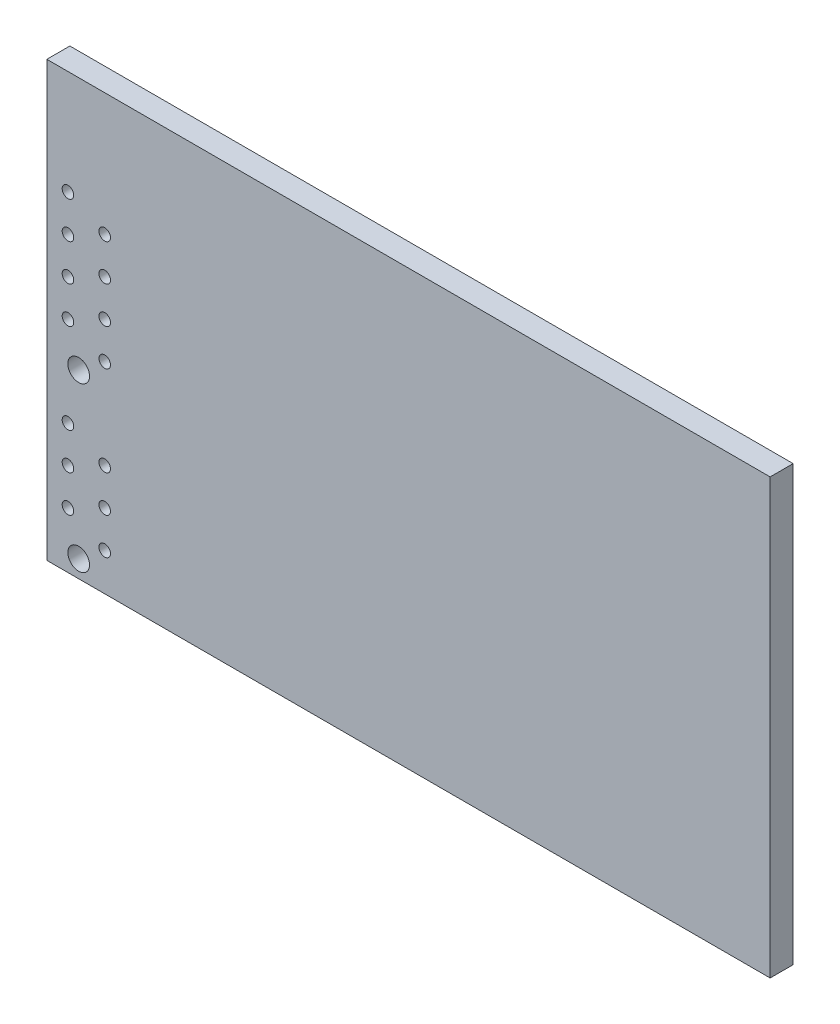
ISO-10303-21;
HEADER;
FILE_DESCRIPTION(('STEP AP214'),'2;1');
FILE_NAME('part.step','',(''),(''),'','','');
FILE_SCHEMA(('AUTOMOTIVE_DESIGN { 1 0 10303 214 1 1 1 1 }'));
ENDSEC;
DATA;
#1=APPLICATION_CONTEXT('core data for automotive mechanical design processes');
#2=APPLICATION_PROTOCOL_DEFINITION('international standard','automotive_design',2000,#1);
#3=PRODUCT_CONTEXT('',#1,'mechanical');
#4=PRODUCT('Part','Part','',(#3));
#5=PRODUCT_RELATED_PRODUCT_CATEGORY('part','',(#4));
#6=PRODUCT_DEFINITION_FORMATION('','',#4);
#7=PRODUCT_DEFINITION_CONTEXT('part definition',#1,'design');
#8=PRODUCT_DEFINITION('design','',#6,#7);
#9=PRODUCT_DEFINITION_SHAPE('','',#8);
#10=(LENGTH_UNIT() NAMED_UNIT(*) SI_UNIT(.MILLI.,.METRE.));
#11=(NAMED_UNIT(*) PLANE_ANGLE_UNIT() SI_UNIT($,.RADIAN.));
#12=(NAMED_UNIT(*) SI_UNIT($,.STERADIAN.) SOLID_ANGLE_UNIT());
#13=UNCERTAINTY_MEASURE_WITH_UNIT(LENGTH_MEASURE(1.E-05),#10,'distance_accuracy_value','');
#14=(GEOMETRIC_REPRESENTATION_CONTEXT(3) GLOBAL_UNCERTAINTY_ASSIGNED_CONTEXT((#13)) GLOBAL_UNIT_ASSIGNED_CONTEXT((#10,
#11,#12)) REPRESENTATION_CONTEXT('',''));
#15=CARTESIAN_POINT('',(0.,0.,0.));
#16=DIRECTION('',(0.,0.,1.));
#17=DIRECTION('',(1.,0.,0.));
#18=AXIS2_PLACEMENT_3D('',#15,#16,#17);
#19=CARTESIAN_POINT('',(0.,0.,1.59143954));
#20=DIRECTION('',(0.,0.,-1.));
#21=DIRECTION('',(-1.,0.,0.));
#22=AXIS2_PLACEMENT_3D('',#19,#20,#21);
#23=PLANE('',#22);
#24=CARTESIAN_POINT('',(3.99999962,16.44000014,1.59143954));
#25=DIRECTION('',(0.,0.,-1.));
#26=DIRECTION('',(-1.,0.,0.));
#27=AXIS2_PLACEMENT_3D('',#24,#25,#26);
#28=CIRCLE('',#27,0.3999992);
#29=CARTESIAN_POINT('',(3.60000042,16.44000014,1.59143954));
#30=VERTEX_POINT('',#29);
#31=EDGE_CURVE('E126',#30,#30,#28,.T.);
#32=ORIENTED_EDGE('',*,*,#31,.T.);
#33=EDGE_LOOP('',(#32));
#34=FACE_BOUND('',#33,.T.);
#35=CARTESIAN_POINT('',(3.99999962,13.90000014,1.59143954));
#36=DIRECTION('',(0.,0.,-1.));
#37=DIRECTION('',(-1.,0.,0.));
#38=AXIS2_PLACEMENT_3D('',#35,#36,#37);
#39=CIRCLE('',#38,0.3999992);
#40=CARTESIAN_POINT('',(3.60000042,13.90000014,1.59143954));
#41=VERTEX_POINT('',#40);
#42=EDGE_CURVE('E130',#41,#41,#39,.T.);
#43=ORIENTED_EDGE('',*,*,#42,.T.);
#44=EDGE_LOOP('',(#43));
#45=FACE_BOUND('',#44,.T.);
#46=CARTESIAN_POINT('',(3.99999962,21.52000014,1.59143954));
#47=DIRECTION('',(0.,0.,-1.));
#48=DIRECTION('',(-1.,0.,0.));
#49=AXIS2_PLACEMENT_3D('',#46,#47,#48);
#50=CIRCLE('',#49,0.3999992);
#51=CARTESIAN_POINT('',(3.60000042,21.52000014,1.59143954));
#52=VERTEX_POINT('',#51);
#53=EDGE_CURVE('E133',#52,#52,#50,.T.);
#54=ORIENTED_EDGE('',*,*,#53,.T.);
#55=EDGE_LOOP('',(#54));
#56=FACE_BOUND('',#55,.T.);
#57=CARTESIAN_POINT('',(3.99999962,18.98000014,1.59143954));
#58=DIRECTION('',(0.,0.,-1.));
#59=DIRECTION('',(-1.,0.,0.));
#60=AXIS2_PLACEMENT_3D('',#57,#58,#59);
#61=CIRCLE('',#60,0.3999992);
#62=CARTESIAN_POINT('',(3.60000042,18.98000014,1.59143954));
#63=VERTEX_POINT('',#62);
#64=EDGE_CURVE('E136',#63,#63,#61,.T.);
#65=ORIENTED_EDGE('',*,*,#64,.T.);
#66=EDGE_LOOP('',(#65));
#67=FACE_BOUND('',#66,.T.);
#68=CARTESIAN_POINT('',(3.99999962,5.14000242,1.59143954));
#69=DIRECTION('',(0.,0.,-1.));
#70=DIRECTION('',(-1.,0.,0.));
#71=AXIS2_PLACEMENT_3D('',#68,#69,#70);
#72=CIRCLE('',#71,0.3999992);
#73=CARTESIAN_POINT('',(3.60000042,5.14000242,1.59143954));
#74=VERTEX_POINT('',#73);
#75=EDGE_CURVE('E139',#74,#74,#72,.T.);
#76=ORIENTED_EDGE('',*,*,#75,.T.);
#77=EDGE_LOOP('',(#76));
#78=FACE_BOUND('',#77,.T.);
#79=CARTESIAN_POINT('',(3.99999962,2.60000242,1.59143954));
#80=DIRECTION('',(0.,0.,-1.));
#81=DIRECTION('',(-1.,0.,0.));
#82=AXIS2_PLACEMENT_3D('',#79,#80,#81);
#83=CIRCLE('',#82,0.3999992);
#84=CARTESIAN_POINT('',(3.60000042,2.60000242,1.59143954));
#85=VERTEX_POINT('',#84);
#86=EDGE_CURVE('E142',#85,#85,#83,.T.);
#87=ORIENTED_EDGE('',*,*,#86,.T.);
#88=EDGE_LOOP('',(#87));
#89=FACE_BOUND('',#88,.T.);
#90=CARTESIAN_POINT('',(2.20000068,12.5000004,1.59143954));
#91=DIRECTION('',(0.,0.,-1.));
#92=DIRECTION('',(-1.,0.,0.));
#93=AXIS2_PLACEMENT_3D('',#90,#91,#92);
#94=CIRCLE('',#93,0.7499985);
#95=CARTESIAN_POINT('',(1.45000218,12.5000004,1.59143954));
#96=VERTEX_POINT('',#95);
#97=EDGE_CURVE('E145',#96,#96,#94,.T.);
#98=ORIENTED_EDGE('',*,*,#97,.T.);
#99=EDGE_LOOP('',(#98));
#100=FACE_BOUND('',#99,.T.);
#101=CARTESIAN_POINT('',(3.99999962,7.68000242,1.59143954));
#102=DIRECTION('',(0.,0.,-1.));
#103=DIRECTION('',(-1.,0.,0.));
#104=AXIS2_PLACEMENT_3D('',#101,#102,#103);
#105=CIRCLE('',#104,0.3999992);
#106=CARTESIAN_POINT('',(3.60000042,7.68000242,1.59143954));
#107=VERTEX_POINT('',#106);
#108=EDGE_CURVE('E148',#107,#107,#105,.T.);
#109=ORIENTED_EDGE('',*,*,#108,.T.);
#110=EDGE_LOOP('',(#109));
#111=FACE_BOUND('',#110,.T.);
#112=CARTESIAN_POINT('',(1.45999962,17.71000014,1.59143954));
#113=DIRECTION('',(0.,0.,-1.));
#114=DIRECTION('',(-1.,0.,0.));
#115=AXIS2_PLACEMENT_3D('',#112,#113,#114);
#116=CIRCLE('',#115,0.3999992);
#117=CARTESIAN_POINT('',(1.06000042,17.71000014,1.59143954));
#118=VERTEX_POINT('',#117);
#119=EDGE_CURVE('E151',#118,#118,#116,.T.);
#120=ORIENTED_EDGE('',*,*,#119,.T.);
#121=EDGE_LOOP('',(#120));
#122=FACE_BOUND('',#121,.T.);
#123=CARTESIAN_POINT('',(1.45999962,15.17000014,1.59143954));
#124=DIRECTION('',(0.,0.,-1.));
#125=DIRECTION('',(-1.,0.,0.));
#126=AXIS2_PLACEMENT_3D('',#123,#124,#125);
#127=CIRCLE('',#126,0.3999992);
#128=CARTESIAN_POINT('',(1.06000042,15.17000014,1.59143954));
#129=VERTEX_POINT('',#128);
#130=EDGE_CURVE('E154',#129,#129,#127,.T.);
#131=ORIENTED_EDGE('',*,*,#130,.T.);
#132=EDGE_LOOP('',(#131));
#133=FACE_BOUND('',#132,.T.);
#134=CARTESIAN_POINT('',(1.45999962,22.79000014,1.59143954));
#135=DIRECTION('',(0.,0.,-1.));
#136=DIRECTION('',(-1.,0.,0.));
#137=AXIS2_PLACEMENT_3D('',#134,#135,#136);
#138=CIRCLE('',#137,0.3999992);
#139=CARTESIAN_POINT('',(1.06000042,22.79000014,1.59143954));
#140=VERTEX_POINT('',#139);
#141=EDGE_CURVE('E157',#140,#140,#138,.T.);
#142=ORIENTED_EDGE('',*,*,#141,.T.);
#143=EDGE_LOOP('',(#142));
#144=FACE_BOUND('',#143,.T.);
#145=CARTESIAN_POINT('',(1.45999962,20.25000014,1.59143954));
#146=DIRECTION('',(0.,0.,-1.));
#147=DIRECTION('',(-1.,0.,0.));
#148=AXIS2_PLACEMENT_3D('',#145,#146,#147);
#149=CIRCLE('',#148,0.3999992);
#150=CARTESIAN_POINT('',(1.06000042,20.25000014,1.59143954));
#151=VERTEX_POINT('',#150);
#152=EDGE_CURVE('E160',#151,#151,#149,.T.);
#153=ORIENTED_EDGE('',*,*,#152,.T.);
#154=EDGE_LOOP('',(#153));
#155=FACE_BOUND('',#154,.T.);
#156=CARTESIAN_POINT('',(1.45999962,3.87000242,1.59143954));
#157=DIRECTION('',(0.,0.,-1.));
#158=DIRECTION('',(-1.,0.,0.));
#159=AXIS2_PLACEMENT_3D('',#156,#157,#158);
#160=CIRCLE('',#159,0.3999992);
#161=CARTESIAN_POINT('',(1.06000042,3.87000242,1.59143954));
#162=VERTEX_POINT('',#161);
#163=EDGE_CURVE('E163',#162,#162,#160,.T.);
#164=ORIENTED_EDGE('',*,*,#163,.T.);
#165=EDGE_LOOP('',(#164));
#166=FACE_BOUND('',#165,.T.);
#167=CARTESIAN_POINT('',(2.20000068,1.20000268,1.59143954));
#168=DIRECTION('',(0.,0.,-1.));
#169=DIRECTION('',(-1.,0.,0.));
#170=AXIS2_PLACEMENT_3D('',#167,#168,#169);
#171=CIRCLE('',#170,0.7499985);
#172=CARTESIAN_POINT('',(1.45000218,1.20000268,1.59143954));
#173=VERTEX_POINT('',#172);
#174=EDGE_CURVE('E166',#173,#173,#171,.T.);
#175=ORIENTED_EDGE('',*,*,#174,.T.);
#176=EDGE_LOOP('',(#175));
#177=FACE_BOUND('',#176,.T.);
#178=CARTESIAN_POINT('',(1.45999962,8.95000242,1.59143954));
#179=DIRECTION('',(0.,0.,-1.));
#180=DIRECTION('',(-1.,0.,0.));
#181=AXIS2_PLACEMENT_3D('',#178,#179,#180);
#182=CIRCLE('',#181,0.3999992);
#183=CARTESIAN_POINT('',(1.06000042,8.95000242,1.59143954));
#184=VERTEX_POINT('',#183);
#185=EDGE_CURVE('E168',#184,#184,#182,.T.);
#186=ORIENTED_EDGE('',*,*,#185,.T.);
#187=EDGE_LOOP('',(#186));
#188=FACE_BOUND('',#187,.T.);
#189=CARTESIAN_POINT('',(1.45999962,6.41000242,1.59143954));
#190=DIRECTION('',(0.,0.,-1.));
#191=DIRECTION('',(-1.,0.,0.));
#192=AXIS2_PLACEMENT_3D('',#189,#190,#191);
#193=CIRCLE('',#192,0.3999992);
#194=CARTESIAN_POINT('',(1.06000042,6.41000242,1.59143954));
#195=VERTEX_POINT('',#194);
#196=EDGE_CURVE('E19',#195,#195,#193,.T.);
#197=ORIENTED_EDGE('',*,*,#196,.T.);
#198=EDGE_LOOP('',(#197));
#199=FACE_BOUND('',#198,.T.);
#200=DIRECTION('',(8.46666638572597E-08,-0.999999999999996,0.));
#201=VECTOR('',#200,1.);
#202=CARTESIAN_POINT('',(50.0000016,0.,1.59143954));
#203=LINE('',#202,#201);
#204=CARTESIAN_POINT('',(50.00000033,0.,1.59143954));
#205=VERTEX_POINT('',#204);
#206=CARTESIAN_POINT('',(49.99999906,29.99999969,1.59143954));
#207=VERTEX_POINT('',#206);
#208=EDGE_CURVE('E54',#205,#207,#203,.F.);
#209=ORIENTED_EDGE('',*,*,#208,.T.);
#210=DIRECTION('',(0.999999999999999,5.07999983143499E-08,0.));
#211=VECTOR('',#210,1.);
#212=CARTESIAN_POINT('',(49.99999906,30.00000096,1.59143954));
#213=LINE('',#212,#211);
#214=CARTESIAN_POINT('',(-1.27000000330068E-06,29.99999842,1.59143954));
#215=VERTEX_POINT('',#214);
#216=EDGE_CURVE('E56',#207,#215,#213,.F.);
#217=ORIENTED_EDGE('',*,*,#216,.T.);
#218=DIRECTION('',(-8.46666714993997E-08,0.999999999999996,0.));
#219=VECTOR('',#218,1.);
#220=CARTESIAN_POINT('',(-2.540000011209E-06,29.99999842,1.59143954));
#221=LINE('',#220,#219);
#222=CARTESIAN_POINT('',(0.,0.,1.59143954));
#223=VERTEX_POINT('',#222);
#224=EDGE_CURVE('E58',#215,#223,#221,.F.);
#225=ORIENTED_EDGE('',*,*,#224,.T.);
#226=DIRECTION('',(1.,0.,0.));
#227=VECTOR('',#226,1.);
#228=CARTESIAN_POINT('',(0.,0.,1.59143954));
#229=LINE('',#228,#227);
#230=EDGE_CURVE('E175',#223,#205,#229,.T.);
#231=ORIENTED_EDGE('',*,*,#230,.T.);
#232=EDGE_LOOP('',(#209,#217,#225,#231));
#233=FACE_BOUND('',#232,.T.);
#234=ADVANCED_FACE('F16',(#34,#45,#56,#67,#78,#89,#100,#111,#122,#133,#144,#155,#166,#177,#188,
#199,#233),#23,.F.);
#235=CARTESIAN_POINT('',(-2.540000011209E-06,29.99999842,0.));
#236=DIRECTION('',(0.999999999999996,8.46666714993997E-08,0.));
#237=DIRECTION('',(-8.46666714993997E-08,0.999999999999996,0.));
#238=AXIS2_PLACEMENT_3D('',#235,#236,#237);
#239=PLANE('',#238);
#240=DIRECTION('',(0.,0.,1.));
#241=VECTOR('',#240,1.);
#242=CARTESIAN_POINT('',(0.,0.,0.));
#243=LINE('',#242,#241);
#244=CARTESIAN_POINT('',(0.,0.,0.));
#245=VERTEX_POINT('',#244);
#246=EDGE_CURVE('E69',#245,#223,#243,.T.);
#247=ORIENTED_EDGE('',*,*,#246,.T.);
#248=ORIENTED_EDGE('',*,*,#224,.F.);
#249=DIRECTION('',(0.,0.,1.));
#250=VECTOR('',#249,1.);
#251=CARTESIAN_POINT('',(-2.54000001587151E-06,29.99999842,0.));
#252=LINE('',#251,#250);
#253=CARTESIAN_POINT('',(-1.90500001043974E-06,29.99999842,0.));
#254=VERTEX_POINT('',#253);
#255=EDGE_CURVE('E63',#215,#254,#252,.F.);
#256=ORIENTED_EDGE('',*,*,#255,.T.);
#257=DIRECTION('',(0.,1.,0.));
#258=VECTOR('',#257,1.);
#259=CARTESIAN_POINT('',(0.,0.,0.));
#260=LINE('',#259,#258);
#261=EDGE_CURVE('E129',#245,#254,#260,.T.);
#262=ORIENTED_EDGE('',*,*,#261,.F.);
#263=EDGE_LOOP('',(#247,#248,#256,#262));
#264=FACE_BOUND('',#263,.T.);
#265=ADVANCED_FACE('F66',(#264),#239,.F.);
#266=CARTESIAN_POINT('',(49.99999906,30.00000096,0.));
#267=DIRECTION('',(5.07999983143499E-08,-0.999999999999999,0.));
#268=DIRECTION('',(0.999999999999999,5.07999983143499E-08,0.));
#269=AXIS2_PLACEMENT_3D('',#266,#267,#268);
#270=PLANE('',#269);
#271=ORIENTED_EDGE('',*,*,#255,.F.);
#272=ORIENTED_EDGE('',*,*,#216,.F.);
#273=DIRECTION('',(0.,0.,1.));
#274=VECTOR('',#273,1.);
#275=CARTESIAN_POINT('',(49.99999906,30.00000096,0.));
#276=LINE('',#275,#274);
#277=CARTESIAN_POINT('',(49.99999906,30.000000325,0.));
#278=VERTEX_POINT('',#277);
#279=EDGE_CURVE('E77',#207,#278,#276,.F.);
#280=ORIENTED_EDGE('',*,*,#279,.T.);
#281=DIRECTION('',(-1.,0.,0.));
#282=VECTOR('',#281,1.);
#283=CARTESIAN_POINT('',(0.,29.99999842,0.));
#284=LINE('',#283,#282);
#285=EDGE_CURVE('E74',#254,#278,#284,.F.);
#286=ORIENTED_EDGE('',*,*,#285,.F.);
#287=EDGE_LOOP('',(#271,#272,#280,#286));
#288=FACE_BOUND('',#287,.T.);
#289=ADVANCED_FACE('F72',(#288),#270,.F.);
#290=CARTESIAN_POINT('',(50.0000016,0.,0.));
#291=DIRECTION('',(-0.999999999999996,-8.46666638572597E-08,0.));
#292=DIRECTION('',(8.46666638572597E-08,-0.999999999999996,0.));
#293=AXIS2_PLACEMENT_3D('',#290,#291,#292);
#294=PLANE('',#293);
#295=ORIENTED_EDGE('',*,*,#279,.F.);
#296=ORIENTED_EDGE('',*,*,#208,.F.);
#297=DIRECTION('',(0.,0.,1.));
#298=VECTOR('',#297,1.);
#299=CARTESIAN_POINT('',(50.0000016,0.,0.));
#300=LINE('',#299,#298);
#301=CARTESIAN_POINT('',(50.000000965,0.,0.));
#302=VERTEX_POINT('',#301);
#303=EDGE_CURVE('E34',#205,#302,#300,.F.);
#304=ORIENTED_EDGE('',*,*,#303,.T.);
#305=DIRECTION('',(0.,1.,0.));
#306=VECTOR('',#305,1.);
#307=CARTESIAN_POINT('',(49.99999906,0.,0.));
#308=LINE('',#307,#306);
#309=EDGE_CURVE('E182',#278,#302,#308,.F.);
#310=ORIENTED_EDGE('',*,*,#309,.F.);
#311=EDGE_LOOP('',(#295,#296,#304,#310));
#312=FACE_BOUND('',#311,.T.);
#313=ADVANCED_FACE('F183',(#312),#294,.F.);
#314=CARTESIAN_POINT('',(0.,0.,0.));
#315=DIRECTION('',(0.,1.,0.));
#316=DIRECTION('',(0.,0.,1.));
#317=AXIS2_PLACEMENT_3D('',#314,#315,#316);
#318=PLANE('',#317);
#319=ORIENTED_EDGE('',*,*,#303,.F.);
#320=ORIENTED_EDGE('',*,*,#230,.F.);
#321=ORIENTED_EDGE('',*,*,#246,.F.);
#322=DIRECTION('',(-1.,0.,0.));
#323=VECTOR('',#322,1.);
#324=CARTESIAN_POINT('',(0.,0.,0.));
#325=LINE('',#324,#323);
#326=EDGE_CURVE('E125',#302,#245,#325,.T.);
#327=ORIENTED_EDGE('',*,*,#326,.F.);
#328=EDGE_LOOP('',(#319,#320,#321,#327));
#329=FACE_BOUND('',#328,.T.);
#330=ADVANCED_FACE('F190',(#329),#318,.F.);
#331=CARTESIAN_POINT('',(1.45999962,6.41000242,0.));
#332=DIRECTION('',(0.,0.,-1.));
#333=DIRECTION('',(-1.,0.,0.));
#334=AXIS2_PLACEMENT_3D('',#331,#332,#333);
#335=CYLINDRICAL_SURFACE('',#334,0.3999992);
#336=ORIENTED_EDGE('',*,*,#196,.F.);
#337=EDGE_LOOP('',(#336));
#338=FACE_BOUND('',#337,.T.);
#339=CARTESIAN_POINT('',(1.45999962,6.41000242,0.));
#340=DIRECTION('',(0.,0.,-1.));
#341=DIRECTION('',(-1.,0.,0.));
#342=AXIS2_PLACEMENT_3D('',#339,#340,#341);
#343=CIRCLE('',#342,0.3999992);
#344=CARTESIAN_POINT('',(1.06000042,6.41000242,0.));
#345=VERTEX_POINT('',#344);
#346=EDGE_CURVE('E122',#345,#345,#343,.F.);
#347=ORIENTED_EDGE('',*,*,#346,.F.);
#348=EDGE_LOOP('',(#347));
#349=FACE_BOUND('',#348,.T.);
#350=ADVANCED_FACE('F192',(#338,#349),#335,.F.);
#351=CARTESIAN_POINT('',(1.45999962,8.95000242,0.));
#352=DIRECTION('',(0.,0.,-1.));
#353=DIRECTION('',(-1.,0.,0.));
#354=AXIS2_PLACEMENT_3D('',#351,#352,#353);
#355=CYLINDRICAL_SURFACE('',#354,0.3999992);
#356=ORIENTED_EDGE('',*,*,#185,.F.);
#357=EDGE_LOOP('',(#356));
#358=FACE_BOUND('',#357,.T.);
#359=CARTESIAN_POINT('',(1.45999962,8.95000242,0.));
#360=DIRECTION('',(0.,0.,-1.));
#361=DIRECTION('',(-1.,0.,0.));
#362=AXIS2_PLACEMENT_3D('',#359,#360,#361);
#363=CIRCLE('',#362,0.3999992);
#364=CARTESIAN_POINT('',(1.06000042,8.95000242,0.));
#365=VERTEX_POINT('',#364);
#366=EDGE_CURVE('E119',#365,#365,#363,.F.);
#367=ORIENTED_EDGE('',*,*,#366,.F.);
#368=EDGE_LOOP('',(#367));
#369=FACE_BOUND('',#368,.T.);
#370=ADVANCED_FACE('F199',(#358,#369),#355,.F.);
#371=CARTESIAN_POINT('',(2.20000068,1.20000268,0.));
#372=DIRECTION('',(0.,0.,-1.));
#373=DIRECTION('',(-1.,0.,0.));
#374=AXIS2_PLACEMENT_3D('',#371,#372,#373);
#375=CYLINDRICAL_SURFACE('',#374,0.7499985);
#376=ORIENTED_EDGE('',*,*,#174,.F.);
#377=EDGE_LOOP('',(#376));
#378=FACE_BOUND('',#377,.T.);
#379=CARTESIAN_POINT('',(2.20000068,1.20000268,0.));
#380=DIRECTION('',(0.,0.,-1.));
#381=DIRECTION('',(-1.,0.,0.));
#382=AXIS2_PLACEMENT_3D('',#379,#380,#381);
#383=CIRCLE('',#382,0.7499985);
#384=CARTESIAN_POINT('',(1.45000218,1.20000268,0.));
#385=VERTEX_POINT('',#384);
#386=EDGE_CURVE('E116',#385,#385,#383,.F.);
#387=ORIENTED_EDGE('',*,*,#386,.F.);
#388=EDGE_LOOP('',(#387));
#389=FACE_BOUND('',#388,.T.);
#390=ADVANCED_FACE('F263',(#378,#389),#375,.F.);
#391=CARTESIAN_POINT('',(1.45999962,3.87000242,0.));
#392=DIRECTION('',(0.,0.,-1.));
#393=DIRECTION('',(-1.,0.,0.));
#394=AXIS2_PLACEMENT_3D('',#391,#392,#393);
#395=CYLINDRICAL_SURFACE('',#394,0.3999992);
#396=ORIENTED_EDGE('',*,*,#163,.F.);
#397=EDGE_LOOP('',(#396));
#398=FACE_BOUND('',#397,.T.);
#399=CARTESIAN_POINT('',(1.45999962,3.87000242,0.));
#400=DIRECTION('',(0.,0.,-1.));
#401=DIRECTION('',(-1.,0.,0.));
#402=AXIS2_PLACEMENT_3D('',#399,#400,#401);
#403=CIRCLE('',#402,0.3999992);
#404=CARTESIAN_POINT('',(1.06000042,3.87000242,0.));
#405=VERTEX_POINT('',#404);
#406=EDGE_CURVE('E113',#405,#405,#403,.F.);
#407=ORIENTED_EDGE('',*,*,#406,.F.);
#408=EDGE_LOOP('',(#407));
#409=FACE_BOUND('',#408,.T.);
#410=ADVANCED_FACE('F259',(#398,#409),#395,.F.);
#411=CARTESIAN_POINT('',(1.45999962,20.25000014,0.));
#412=DIRECTION('',(0.,0.,-1.));
#413=DIRECTION('',(-1.,0.,0.));
#414=AXIS2_PLACEMENT_3D('',#411,#412,#413);
#415=CYLINDRICAL_SURFACE('',#414,0.3999992);
#416=ORIENTED_EDGE('',*,*,#152,.F.);
#417=EDGE_LOOP('',(#416));
#418=FACE_BOUND('',#417,.T.);
#419=CARTESIAN_POINT('',(1.45999962,20.25000014,0.));
#420=DIRECTION('',(0.,0.,-1.));
#421=DIRECTION('',(-1.,0.,0.));
#422=AXIS2_PLACEMENT_3D('',#419,#420,#421);
#423=CIRCLE('',#422,0.3999992);
#424=CARTESIAN_POINT('',(1.06000042,20.25000014,0.));
#425=VERTEX_POINT('',#424);
#426=EDGE_CURVE('E110',#425,#425,#423,.F.);
#427=ORIENTED_EDGE('',*,*,#426,.F.);
#428=EDGE_LOOP('',(#427));
#429=FACE_BOUND('',#428,.T.);
#430=ADVANCED_FACE('F255',(#418,#429),#415,.F.);
#431=CARTESIAN_POINT('',(1.45999962,22.79000014,0.));
#432=DIRECTION('',(0.,0.,-1.));
#433=DIRECTION('',(-1.,0.,0.));
#434=AXIS2_PLACEMENT_3D('',#431,#432,#433);
#435=CYLINDRICAL_SURFACE('',#434,0.3999992);
#436=ORIENTED_EDGE('',*,*,#141,.F.);
#437=EDGE_LOOP('',(#436));
#438=FACE_BOUND('',#437,.T.);
#439=CARTESIAN_POINT('',(1.45999962,22.79000014,0.));
#440=DIRECTION('',(0.,0.,-1.));
#441=DIRECTION('',(-1.,0.,0.));
#442=AXIS2_PLACEMENT_3D('',#439,#440,#441);
#443=CIRCLE('',#442,0.3999992);
#444=CARTESIAN_POINT('',(1.06000042,22.79000014,0.));
#445=VERTEX_POINT('',#444);
#446=EDGE_CURVE('E107',#445,#445,#443,.F.);
#447=ORIENTED_EDGE('',*,*,#446,.F.);
#448=EDGE_LOOP('',(#447));
#449=FACE_BOUND('',#448,.T.);
#450=ADVANCED_FACE('F251',(#438,#449),#435,.F.);
#451=CARTESIAN_POINT('',(1.45999962,15.17000014,0.));
#452=DIRECTION('',(0.,0.,-1.));
#453=DIRECTION('',(-1.,0.,0.));
#454=AXIS2_PLACEMENT_3D('',#451,#452,#453);
#455=CYLINDRICAL_SURFACE('',#454,0.3999992);
#456=ORIENTED_EDGE('',*,*,#130,.F.);
#457=EDGE_LOOP('',(#456));
#458=FACE_BOUND('',#457,.T.);
#459=CARTESIAN_POINT('',(1.45999962,15.17000014,0.));
#460=DIRECTION('',(0.,0.,-1.));
#461=DIRECTION('',(-1.,0.,0.));
#462=AXIS2_PLACEMENT_3D('',#459,#460,#461);
#463=CIRCLE('',#462,0.3999992);
#464=CARTESIAN_POINT('',(1.06000042,15.17000014,0.));
#465=VERTEX_POINT('',#464);
#466=EDGE_CURVE('E104',#465,#465,#463,.F.);
#467=ORIENTED_EDGE('',*,*,#466,.F.);
#468=EDGE_LOOP('',(#467));
#469=FACE_BOUND('',#468,.T.);
#470=ADVANCED_FACE('F247',(#458,#469),#455,.F.);
#471=CARTESIAN_POINT('',(1.45999962,17.71000014,0.));
#472=DIRECTION('',(0.,0.,-1.));
#473=DIRECTION('',(-1.,0.,0.));
#474=AXIS2_PLACEMENT_3D('',#471,#472,#473);
#475=CYLINDRICAL_SURFACE('',#474,0.3999992);
#476=ORIENTED_EDGE('',*,*,#119,.F.);
#477=EDGE_LOOP('',(#476));
#478=FACE_BOUND('',#477,.T.);
#479=CARTESIAN_POINT('',(1.45999962,17.71000014,0.));
#480=DIRECTION('',(0.,0.,-1.));
#481=DIRECTION('',(-1.,0.,0.));
#482=AXIS2_PLACEMENT_3D('',#479,#480,#481);
#483=CIRCLE('',#482,0.3999992);
#484=CARTESIAN_POINT('',(1.06000042,17.71000014,0.));
#485=VERTEX_POINT('',#484);
#486=EDGE_CURVE('E101',#485,#485,#483,.F.);
#487=ORIENTED_EDGE('',*,*,#486,.F.);
#488=EDGE_LOOP('',(#487));
#489=FACE_BOUND('',#488,.T.);
#490=ADVANCED_FACE('F243',(#478,#489),#475,.F.);
#491=CARTESIAN_POINT('',(3.99999962,7.68000242,0.));
#492=DIRECTION('',(0.,0.,-1.));
#493=DIRECTION('',(-1.,0.,0.));
#494=AXIS2_PLACEMENT_3D('',#491,#492,#493);
#495=CYLINDRICAL_SURFACE('',#494,0.3999992);
#496=ORIENTED_EDGE('',*,*,#108,.F.);
#497=EDGE_LOOP('',(#496));
#498=FACE_BOUND('',#497,.T.);
#499=CARTESIAN_POINT('',(3.99999962,7.68000242,0.));
#500=DIRECTION('',(0.,0.,-1.));
#501=DIRECTION('',(-1.,0.,0.));
#502=AXIS2_PLACEMENT_3D('',#499,#500,#501);
#503=CIRCLE('',#502,0.3999992);
#504=CARTESIAN_POINT('',(3.60000042,7.68000242,0.));
#505=VERTEX_POINT('',#504);
#506=EDGE_CURVE('E98',#505,#505,#503,.F.);
#507=ORIENTED_EDGE('',*,*,#506,.F.);
#508=EDGE_LOOP('',(#507));
#509=FACE_BOUND('',#508,.T.);
#510=ADVANCED_FACE('F239',(#498,#509),#495,.F.);
#511=CARTESIAN_POINT('',(2.20000068,12.5000004,0.));
#512=DIRECTION('',(0.,0.,-1.));
#513=DIRECTION('',(-1.,0.,0.));
#514=AXIS2_PLACEMENT_3D('',#511,#512,#513);
#515=CYLINDRICAL_SURFACE('',#514,0.7499985);
#516=ORIENTED_EDGE('',*,*,#97,.F.);
#517=EDGE_LOOP('',(#516));
#518=FACE_BOUND('',#517,.T.);
#519=CARTESIAN_POINT('',(2.20000068,12.5000004,0.));
#520=DIRECTION('',(0.,0.,-1.));
#521=DIRECTION('',(-1.,0.,0.));
#522=AXIS2_PLACEMENT_3D('',#519,#520,#521);
#523=CIRCLE('',#522,0.7499985);
#524=CARTESIAN_POINT('',(1.45000218,12.5000004,0.));
#525=VERTEX_POINT('',#524);
#526=EDGE_CURVE('E95',#525,#525,#523,.F.);
#527=ORIENTED_EDGE('',*,*,#526,.F.);
#528=EDGE_LOOP('',(#527));
#529=FACE_BOUND('',#528,.T.);
#530=ADVANCED_FACE('F235',(#518,#529),#515,.F.);
#531=CARTESIAN_POINT('',(3.99999962,2.60000242,0.));
#532=DIRECTION('',(0.,0.,-1.));
#533=DIRECTION('',(-1.,0.,0.));
#534=AXIS2_PLACEMENT_3D('',#531,#532,#533);
#535=CYLINDRICAL_SURFACE('',#534,0.3999992);
#536=ORIENTED_EDGE('',*,*,#86,.F.);
#537=EDGE_LOOP('',(#536));
#538=FACE_BOUND('',#537,.T.);
#539=CARTESIAN_POINT('',(3.99999962,2.60000242,0.));
#540=DIRECTION('',(0.,0.,-1.));
#541=DIRECTION('',(-1.,0.,0.));
#542=AXIS2_PLACEMENT_3D('',#539,#540,#541);
#543=CIRCLE('',#542,0.3999992);
#544=CARTESIAN_POINT('',(3.60000042,2.60000242,0.));
#545=VERTEX_POINT('',#544);
#546=EDGE_CURVE('E92',#545,#545,#543,.F.);
#547=ORIENTED_EDGE('',*,*,#546,.F.);
#548=EDGE_LOOP('',(#547));
#549=FACE_BOUND('',#548,.T.);
#550=ADVANCED_FACE('F231',(#538,#549),#535,.F.);
#551=CARTESIAN_POINT('',(3.99999962,5.14000242,0.));
#552=DIRECTION('',(0.,0.,-1.));
#553=DIRECTION('',(-1.,0.,0.));
#554=AXIS2_PLACEMENT_3D('',#551,#552,#553);
#555=CYLINDRICAL_SURFACE('',#554,0.3999992);
#556=ORIENTED_EDGE('',*,*,#75,.F.);
#557=EDGE_LOOP('',(#556));
#558=FACE_BOUND('',#557,.T.);
#559=CARTESIAN_POINT('',(3.99999962,5.14000242,0.));
#560=DIRECTION('',(0.,0.,-1.));
#561=DIRECTION('',(-1.,0.,0.));
#562=AXIS2_PLACEMENT_3D('',#559,#560,#561);
#563=CIRCLE('',#562,0.3999992);
#564=CARTESIAN_POINT('',(3.60000042,5.14000242,0.));
#565=VERTEX_POINT('',#564);
#566=EDGE_CURVE('E89',#565,#565,#563,.F.);
#567=ORIENTED_EDGE('',*,*,#566,.F.);
#568=EDGE_LOOP('',(#567));
#569=FACE_BOUND('',#568,.T.);
#570=ADVANCED_FACE('F227',(#558,#569),#555,.F.);
#571=CARTESIAN_POINT('',(3.99999962,18.98000014,0.));
#572=DIRECTION('',(0.,0.,-1.));
#573=DIRECTION('',(-1.,0.,0.));
#574=AXIS2_PLACEMENT_3D('',#571,#572,#573);
#575=CYLINDRICAL_SURFACE('',#574,0.3999992);
#576=ORIENTED_EDGE('',*,*,#64,.F.);
#577=EDGE_LOOP('',(#576));
#578=FACE_BOUND('',#577,.T.);
#579=CARTESIAN_POINT('',(3.99999962,18.98000014,0.));
#580=DIRECTION('',(0.,0.,-1.));
#581=DIRECTION('',(-1.,0.,0.));
#582=AXIS2_PLACEMENT_3D('',#579,#580,#581);
#583=CIRCLE('',#582,0.3999992);
#584=CARTESIAN_POINT('',(3.60000042,18.98000014,0.));
#585=VERTEX_POINT('',#584);
#586=EDGE_CURVE('E86',#585,#585,#583,.F.);
#587=ORIENTED_EDGE('',*,*,#586,.F.);
#588=EDGE_LOOP('',(#587));
#589=FACE_BOUND('',#588,.T.);
#590=ADVANCED_FACE('F223',(#578,#589),#575,.F.);
#591=CARTESIAN_POINT('',(3.99999962,21.52000014,0.));
#592=DIRECTION('',(0.,0.,-1.));
#593=DIRECTION('',(-1.,0.,0.));
#594=AXIS2_PLACEMENT_3D('',#591,#592,#593);
#595=CYLINDRICAL_SURFACE('',#594,0.3999992);
#596=ORIENTED_EDGE('',*,*,#53,.F.);
#597=EDGE_LOOP('',(#596));
#598=FACE_BOUND('',#597,.T.);
#599=CARTESIAN_POINT('',(3.99999962,21.52000014,0.));
#600=DIRECTION('',(0.,0.,-1.));
#601=DIRECTION('',(-1.,0.,0.));
#602=AXIS2_PLACEMENT_3D('',#599,#600,#601);
#603=CIRCLE('',#602,0.3999992);
#604=CARTESIAN_POINT('',(3.60000042,21.52000014,0.));
#605=VERTEX_POINT('',#604);
#606=EDGE_CURVE('E83',#605,#605,#603,.F.);
#607=ORIENTED_EDGE('',*,*,#606,.F.);
#608=EDGE_LOOP('',(#607));
#609=FACE_BOUND('',#608,.T.);
#610=ADVANCED_FACE('F219',(#598,#609),#595,.F.);
#611=CARTESIAN_POINT('',(3.99999962,13.90000014,0.));
#612=DIRECTION('',(0.,0.,-1.));
#613=DIRECTION('',(-1.,0.,0.));
#614=AXIS2_PLACEMENT_3D('',#611,#612,#613);
#615=CYLINDRICAL_SURFACE('',#614,0.3999992);
#616=ORIENTED_EDGE('',*,*,#42,.F.);
#617=EDGE_LOOP('',(#616));
#618=FACE_BOUND('',#617,.T.);
#619=CARTESIAN_POINT('',(3.99999962,13.90000014,0.));
#620=DIRECTION('',(0.,0.,-1.));
#621=DIRECTION('',(-1.,0.,0.));
#622=AXIS2_PLACEMENT_3D('',#619,#620,#621);
#623=CIRCLE('',#622,0.3999992);
#624=CARTESIAN_POINT('',(3.60000042,13.90000014,0.));
#625=VERTEX_POINT('',#624);
#626=EDGE_CURVE('E25',#625,#625,#623,.F.);
#627=ORIENTED_EDGE('',*,*,#626,.F.);
#628=EDGE_LOOP('',(#627));
#629=FACE_BOUND('',#628,.T.);
#630=ADVANCED_FACE('F212',(#618,#629),#615,.F.);
#631=CARTESIAN_POINT('',(3.99999962,16.44000014,0.));
#632=DIRECTION('',(0.,0.,-1.));
#633=DIRECTION('',(-1.,0.,0.));
#634=AXIS2_PLACEMENT_3D('',#631,#632,#633);
#635=CYLINDRICAL_SURFACE('',#634,0.3999992);
#636=ORIENTED_EDGE('',*,*,#31,.F.);
#637=EDGE_LOOP('',(#636));
#638=FACE_BOUND('',#637,.T.);
#639=CARTESIAN_POINT('',(3.99999962,16.44000014,0.));
#640=DIRECTION('',(0.,0.,-1.));
#641=DIRECTION('',(-1.,0.,0.));
#642=AXIS2_PLACEMENT_3D('',#639,#640,#641);
#643=CIRCLE('',#642,0.3999992);
#644=CARTESIAN_POINT('',(3.60000042,16.44000014,0.));
#645=VERTEX_POINT('',#644);
#646=EDGE_CURVE('E11',#645,#645,#643,.F.);
#647=ORIENTED_EDGE('',*,*,#646,.F.);
#648=EDGE_LOOP('',(#647));
#649=FACE_BOUND('',#648,.T.);
#650=ADVANCED_FACE('F204',(#638,#649),#635,.F.);
#651=CARTESIAN_POINT('',(0.,0.,0.));
#652=DIRECTION('',(0.,0.,-1.));
#653=DIRECTION('',(-1.,0.,0.));
#654=AXIS2_PLACEMENT_3D('',#651,#652,#653);
#655=PLANE('',#654);
#656=ORIENTED_EDGE('',*,*,#646,.T.);
#657=EDGE_LOOP('',(#656));
#658=FACE_BOUND('',#657,.T.);
#659=ORIENTED_EDGE('',*,*,#626,.T.);
#660=EDGE_LOOP('',(#659));
#661=FACE_BOUND('',#660,.T.);
#662=ORIENTED_EDGE('',*,*,#606,.T.);
#663=EDGE_LOOP('',(#662));
#664=FACE_BOUND('',#663,.T.);
#665=ORIENTED_EDGE('',*,*,#586,.T.);
#666=EDGE_LOOP('',(#665));
#667=FACE_BOUND('',#666,.T.);
#668=ORIENTED_EDGE('',*,*,#566,.T.);
#669=EDGE_LOOP('',(#668));
#670=FACE_BOUND('',#669,.T.);
#671=ORIENTED_EDGE('',*,*,#546,.T.);
#672=EDGE_LOOP('',(#671));
#673=FACE_BOUND('',#672,.T.);
#674=ORIENTED_EDGE('',*,*,#526,.T.);
#675=EDGE_LOOP('',(#674));
#676=FACE_BOUND('',#675,.T.);
#677=ORIENTED_EDGE('',*,*,#506,.T.);
#678=EDGE_LOOP('',(#677));
#679=FACE_BOUND('',#678,.T.);
#680=ORIENTED_EDGE('',*,*,#486,.T.);
#681=EDGE_LOOP('',(#680));
#682=FACE_BOUND('',#681,.T.);
#683=ORIENTED_EDGE('',*,*,#466,.T.);
#684=EDGE_LOOP('',(#683));
#685=FACE_BOUND('',#684,.T.);
#686=ORIENTED_EDGE('',*,*,#446,.T.);
#687=EDGE_LOOP('',(#686));
#688=FACE_BOUND('',#687,.T.);
#689=ORIENTED_EDGE('',*,*,#426,.T.);
#690=EDGE_LOOP('',(#689));
#691=FACE_BOUND('',#690,.T.);
#692=ORIENTED_EDGE('',*,*,#406,.T.);
#693=EDGE_LOOP('',(#692));
#694=FACE_BOUND('',#693,.T.);
#695=ORIENTED_EDGE('',*,*,#386,.T.);
#696=EDGE_LOOP('',(#695));
#697=FACE_BOUND('',#696,.T.);
#698=ORIENTED_EDGE('',*,*,#366,.T.);
#699=EDGE_LOOP('',(#698));
#700=FACE_BOUND('',#699,.T.);
#701=ORIENTED_EDGE('',*,*,#346,.T.);
#702=EDGE_LOOP('',(#701));
#703=FACE_BOUND('',#702,.T.);
#704=ORIENTED_EDGE('',*,*,#309,.T.);
#705=ORIENTED_EDGE('',*,*,#326,.T.);
#706=ORIENTED_EDGE('',*,*,#261,.T.);
#707=ORIENTED_EDGE('',*,*,#285,.T.);
#708=EDGE_LOOP('',(#704,#705,#706,#707));
#709=FACE_BOUND('',#708,.T.);
#710=ADVANCED_FACE('F187',(#658,#661,#664,#667,#670,#673,#676,#679,#682,#685,#688,#691,#694,
#697,#700,#703,#709),#655,.T.);
#711=CLOSED_SHELL('',(#234,#265,#289,#313,#330,#350,#370,#390,#410,#430,#450,#470,#490,#510,
#530,#550,#570,#590,#610,#630,#650,#710));
#712=MANIFOLD_SOLID_BREP('B1',#711);
#713=ADVANCED_BREP_SHAPE_REPRESENTATION('',(#18,#712),#14);
#714=SHAPE_DEFINITION_REPRESENTATION(#9,#713);
ENDSEC;
END-ISO-10303-21;
